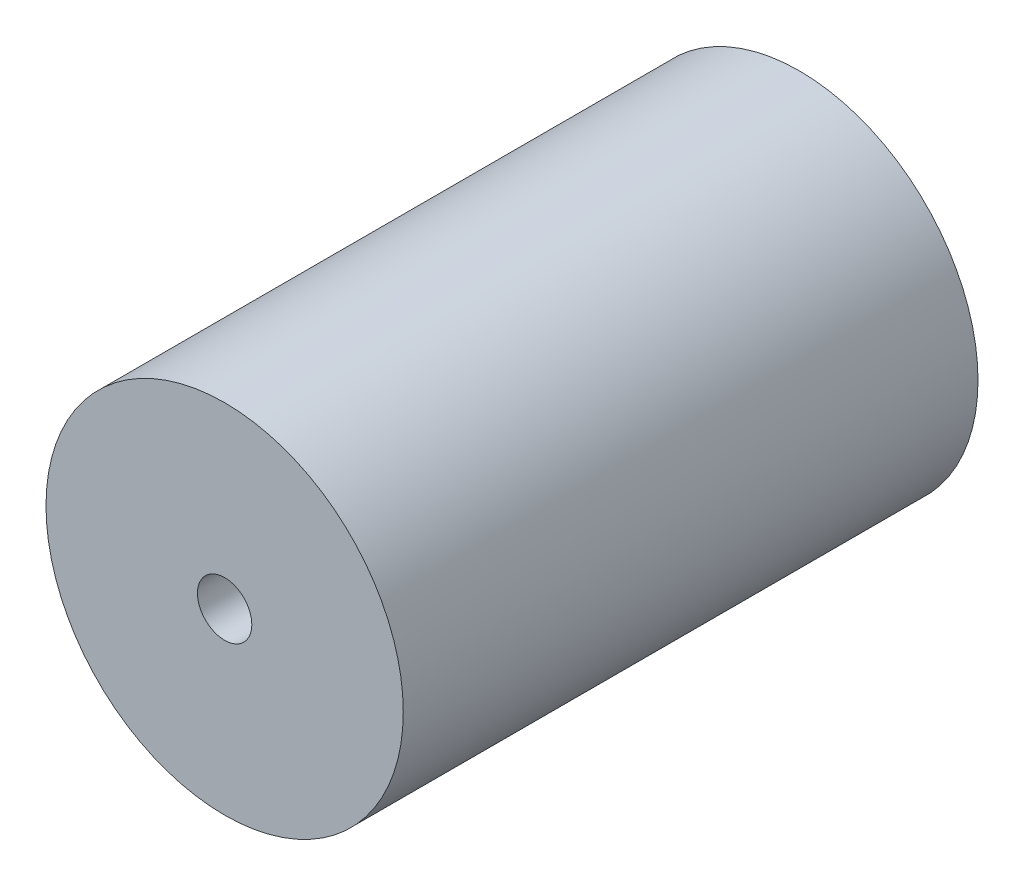
ISO-10303-21;
HEADER;
FILE_DESCRIPTION(('STEP AP214'),'2;1');
FILE_NAME('part.step','',(''),(''),'','','');
FILE_SCHEMA(('AUTOMOTIVE_DESIGN { 1 0 10303 214 1 1 1 1 }'));
ENDSEC;
DATA;
#1=APPLICATION_CONTEXT('core data for automotive mechanical design processes');
#2=APPLICATION_PROTOCOL_DEFINITION('international standard','automotive_design',2000,#1);
#3=PRODUCT_CONTEXT('',#1,'mechanical');
#4=PRODUCT('Part','Part','',(#3));
#5=PRODUCT_RELATED_PRODUCT_CATEGORY('part','',(#4));
#6=PRODUCT_DEFINITION_FORMATION('','',#4);
#7=PRODUCT_DEFINITION_CONTEXT('part definition',#1,'design');
#8=PRODUCT_DEFINITION('design','',#6,#7);
#9=PRODUCT_DEFINITION_SHAPE('','',#8);
#10=(LENGTH_UNIT() NAMED_UNIT(*) SI_UNIT(.MILLI.,.METRE.));
#11=(NAMED_UNIT(*) PLANE_ANGLE_UNIT() SI_UNIT($,.RADIAN.));
#12=(NAMED_UNIT(*) SI_UNIT($,.STERADIAN.) SOLID_ANGLE_UNIT());
#13=UNCERTAINTY_MEASURE_WITH_UNIT(LENGTH_MEASURE(1.E-05),#10,'distance_accuracy_value','');
#14=(GEOMETRIC_REPRESENTATION_CONTEXT(3) GLOBAL_UNCERTAINTY_ASSIGNED_CONTEXT((#13)) GLOBAL_UNIT_ASSIGNED_CONTEXT((#10,
#11,#12)) REPRESENTATION_CONTEXT('',''));
#15=CARTESIAN_POINT('',(0.,0.,0.));
#16=DIRECTION('',(0.,0.,1.));
#17=DIRECTION('',(1.,0.,0.));
#18=AXIS2_PLACEMENT_3D('',#15,#16,#17);
#19=CARTESIAN_POINT('',(0.,0.,37.));
#20=DIRECTION('',(0.,0.,-1.));
#21=DIRECTION('',(-1.,0.,0.));
#22=AXIS2_PLACEMENT_3D('',#19,#20,#21);
#23=CYLINDRICAL_SURFACE('',#22,11.5);
#24=CARTESIAN_POINT('',(0.,0.,37.));
#25=DIRECTION('',(0.,0.,1.));
#26=DIRECTION('',(1.,0.,0.));
#27=AXIS2_PLACEMENT_3D('',#24,#25,#26);
#28=CIRCLE('',#27,11.5);
#29=CARTESIAN_POINT('',(11.5,0.,37.));
#30=VERTEX_POINT('',#29);
#31=EDGE_CURVE('E10',#30,#30,#28,.T.);
#32=ORIENTED_EDGE('',*,*,#31,.F.);
#33=EDGE_LOOP('',(#32));
#34=FACE_BOUND('',#33,.T.);
#35=CARTESIAN_POINT('',(0.,0.,0.));
#36=DIRECTION('',(0.,0.,1.));
#37=DIRECTION('',(1.,0.,0.));
#38=AXIS2_PLACEMENT_3D('',#35,#36,#37);
#39=CIRCLE('',#38,11.5);
#40=CARTESIAN_POINT('',(11.5,0.,0.));
#41=VERTEX_POINT('',#40);
#42=EDGE_CURVE('E34',#41,#41,#39,.T.);
#43=ORIENTED_EDGE('',*,*,#42,.T.);
#44=EDGE_LOOP('',(#43));
#45=FACE_BOUND('',#44,.T.);
#46=ADVANCED_FACE('F31',(#34,#45),#23,.T.);
#47=CARTESIAN_POINT('',(0.,0.,37.));
#48=DIRECTION('',(0.,0.,1.));
#49=DIRECTION('',(1.,0.,0.));
#50=AXIS2_PLACEMENT_3D('',#47,#48,#49);
#51=PLANE('',#50);
#52=CARTESIAN_POINT('',(0.,0.,37.));
#53=DIRECTION('',(0.,0.,1.));
#54=DIRECTION('',(1.,0.,0.));
#55=AXIS2_PLACEMENT_3D('',#52,#53,#54);
#56=CIRCLE('',#55,1.75);
#57=CARTESIAN_POINT('',(1.75,0.,37.));
#58=VERTEX_POINT('',#57);
#59=EDGE_CURVE('E43',#58,#58,#56,.T.);
#60=ORIENTED_EDGE('',*,*,#59,.F.);
#61=EDGE_LOOP('',(#60));
#62=FACE_BOUND('',#61,.T.);
#63=ORIENTED_EDGE('',*,*,#31,.T.);
#64=EDGE_LOOP('',(#63));
#65=FACE_BOUND('',#64,.T.);
#66=ADVANCED_FACE('F58',(#62,#65),#51,.T.);
#67=CARTESIAN_POINT('',(0.,0.,0.));
#68=DIRECTION('',(0.,0.,1.));
#69=DIRECTION('',(1.,0.,0.));
#70=AXIS2_PLACEMENT_3D('',#67,#68,#69);
#71=PLANE('',#70);
#72=CARTESIAN_POINT('',(0.,0.,0.));
#73=DIRECTION('',(0.,0.,1.));
#74=DIRECTION('',(1.,0.,0.));
#75=AXIS2_PLACEMENT_3D('',#72,#73,#74);
#76=CIRCLE('',#75,1.75);
#77=CARTESIAN_POINT('',(1.75,0.,0.));
#78=VERTEX_POINT('',#77);
#79=EDGE_CURVE('E41',#78,#78,#76,.T.);
#80=ORIENTED_EDGE('',*,*,#79,.T.);
#81=EDGE_LOOP('',(#80));
#82=FACE_BOUND('',#81,.T.);
#83=ORIENTED_EDGE('',*,*,#42,.F.);
#84=EDGE_LOOP('',(#83));
#85=FACE_BOUND('',#84,.T.);
#86=ADVANCED_FACE('F49',(#82,#85),#71,.F.);
#87=CARTESIAN_POINT('',(0.,0.,0.));
#88=DIRECTION('',(0.,0.,1.));
#89=DIRECTION('',(1.,0.,0.));
#90=AXIS2_PLACEMENT_3D('',#87,#88,#89);
#91=CYLINDRICAL_SURFACE('',#90,1.75);
#92=ORIENTED_EDGE('',*,*,#79,.F.);
#93=EDGE_LOOP('',(#92));
#94=FACE_BOUND('',#93,.T.);
#95=ORIENTED_EDGE('',*,*,#59,.T.);
#96=EDGE_LOOP('',(#95));
#97=FACE_BOUND('',#96,.T.);
#98=ADVANCED_FACE('F52',(#94,#97),#91,.F.);
#99=CLOSED_SHELL('',(#46,#66,#86,#98));
#100=MANIFOLD_SOLID_BREP('B2',#99);
#101=ADVANCED_BREP_SHAPE_REPRESENTATION('',(#18,#100),#14);
#102=SHAPE_DEFINITION_REPRESENTATION(#9,#101);
ENDSEC;
END-ISO-10303-21;
